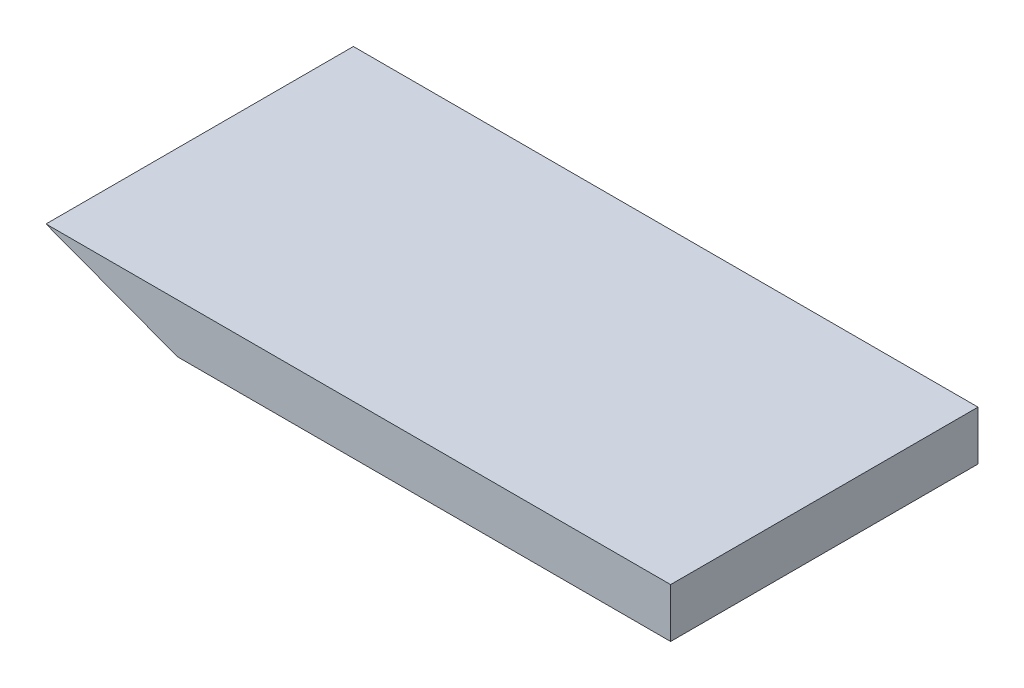
ISO-10303-21;
HEADER;
FILE_DESCRIPTION(('STEP AP214'),'2;1');
FILE_NAME('part.step','',(''),(''),'','','');
FILE_SCHEMA(('AUTOMOTIVE_DESIGN { 1 0 10303 214 1 1 1 1 }'));
ENDSEC;
DATA;
#1=APPLICATION_CONTEXT('core data for automotive mechanical design processes');
#2=APPLICATION_PROTOCOL_DEFINITION('international standard','automotive_design',2000,#1);
#3=PRODUCT_CONTEXT('',#1,'mechanical');
#4=PRODUCT('Part','Part','',(#3));
#5=PRODUCT_RELATED_PRODUCT_CATEGORY('part','',(#4));
#6=PRODUCT_DEFINITION_FORMATION('','',#4);
#7=PRODUCT_DEFINITION_CONTEXT('part definition',#1,'design');
#8=PRODUCT_DEFINITION('design','',#6,#7);
#9=PRODUCT_DEFINITION_SHAPE('','',#8);
#10=(LENGTH_UNIT() NAMED_UNIT(*) SI_UNIT(.MILLI.,.METRE.));
#11=(NAMED_UNIT(*) PLANE_ANGLE_UNIT() SI_UNIT($,.RADIAN.));
#12=(NAMED_UNIT(*) SI_UNIT($,.STERADIAN.) SOLID_ANGLE_UNIT());
#13=UNCERTAINTY_MEASURE_WITH_UNIT(LENGTH_MEASURE(1.E-05),#10,'distance_accuracy_value','');
#14=(GEOMETRIC_REPRESENTATION_CONTEXT(3) GLOBAL_UNCERTAINTY_ASSIGNED_CONTEXT((#13)) GLOBAL_UNIT_ASSIGNED_CONTEXT((#10,
#11,#12)) REPRESENTATION_CONTEXT('',''));
#15=CARTESIAN_POINT('',(0.,0.,0.));
#16=DIRECTION('',(0.,0.,1.));
#17=DIRECTION('',(1.,0.,0.));
#18=AXIS2_PLACEMENT_3D('',#15,#16,#17);
#19=CARTESIAN_POINT('',(19.,3.,-9.35));
#20=DIRECTION('',(-1.,0.,0.));
#21=DIRECTION('',(0.,0.,1.));
#22=AXIS2_PLACEMENT_3D('',#19,#20,#21);
#23=PLANE('',#22);
#24=DIRECTION('',(0.,0.,-1.));
#25=VECTOR('',#24,1.);
#26=CARTESIAN_POINT('',(19.,0.,-9.35));
#27=LINE('',#26,#25);
#28=CARTESIAN_POINT('',(19.,0.,9.35));
#29=VERTEX_POINT('',#28);
#30=CARTESIAN_POINT('',(19.,0.,-9.35));
#31=VERTEX_POINT('',#30);
#32=EDGE_CURVE('E97',#29,#31,#27,.T.);
#33=ORIENTED_EDGE('',*,*,#32,.T.);
#34=DIRECTION('',(0.,-1.,0.));
#35=VECTOR('',#34,1.);
#36=CARTESIAN_POINT('',(19.,3.,-9.35));
#37=LINE('',#36,#35);
#38=CARTESIAN_POINT('',(19.,3.,-9.35));
#39=VERTEX_POINT('',#38);
#40=EDGE_CURVE('E11',#39,#31,#37,.T.);
#41=ORIENTED_EDGE('',*,*,#40,.F.);
#42=DIRECTION('',(0.,0.,-1.));
#43=VECTOR('',#42,1.);
#44=CARTESIAN_POINT('',(19.,3.,-9.35));
#45=LINE('',#44,#43);
#46=CARTESIAN_POINT('',(19.,3.,9.35));
#47=VERTEX_POINT('',#46);
#48=EDGE_CURVE('E92',#47,#39,#45,.T.);
#49=ORIENTED_EDGE('',*,*,#48,.F.);
#50=DIRECTION('',(0.,-1.,0.));
#51=VECTOR('',#50,1.);
#52=CARTESIAN_POINT('',(19.,3.,9.35));
#53=LINE('',#52,#51);
#54=EDGE_CURVE('E53',#47,#29,#53,.T.);
#55=ORIENTED_EDGE('',*,*,#54,.T.);
#56=EDGE_LOOP('',(#33,#41,#49,#55));
#57=FACE_BOUND('',#56,.T.);
#58=ADVANCED_FACE('F43',(#57),#23,.F.);
#59=CARTESIAN_POINT('',(-19.,3.,-9.35));
#60=DIRECTION('',(0.,0.,1.));
#61=DIRECTION('',(1.,0.,0.));
#62=AXIS2_PLACEMENT_3D('',#59,#60,#61);
#63=PLANE('',#62);
#64=DIRECTION('',(-1.,0.,0.));
#65=VECTOR('',#64,1.);
#66=CARTESIAN_POINT('',(-19.,0.,-9.35));
#67=LINE('',#66,#65);
#68=CARTESIAN_POINT('',(-11.,0.,-9.35));
#69=VERTEX_POINT('',#68);
#70=EDGE_CURVE('E93',#31,#69,#67,.T.);
#71=ORIENTED_EDGE('',*,*,#70,.T.);
#72=DIRECTION('',(-0.936329177569045,0.351123441588392,0.));
#73=VECTOR('',#72,1.);
#74=CARTESIAN_POINT('',(-11.,0.,-9.35));
#75=LINE('',#74,#73);
#76=CARTESIAN_POINT('',(-19.,3.,-9.35));
#77=VERTEX_POINT('',#76);
#78=EDGE_CURVE('E60',#69,#77,#75,.T.);
#79=ORIENTED_EDGE('',*,*,#78,.T.);
#80=DIRECTION('',(-1.,0.,0.));
#81=VECTOR('',#80,1.);
#82=CARTESIAN_POINT('',(-19.,3.,-9.35));
#83=LINE('',#82,#81);
#84=EDGE_CURVE('E117',#39,#77,#83,.T.);
#85=ORIENTED_EDGE('',*,*,#84,.F.);
#86=ORIENTED_EDGE('',*,*,#40,.T.);
#87=EDGE_LOOP('',(#71,#79,#85,#86));
#88=FACE_BOUND('',#87,.T.);
#89=ADVANCED_FACE('F133',(#88),#63,.F.);
#90=CARTESIAN_POINT('',(-19.,3.,9.35));
#91=DIRECTION('',(0.,0.,-1.));
#92=DIRECTION('',(-1.,0.,0.));
#93=AXIS2_PLACEMENT_3D('',#90,#91,#92);
#94=PLANE('',#93);
#95=DIRECTION('',(1.,0.,0.));
#96=VECTOR('',#95,1.);
#97=CARTESIAN_POINT('',(-19.,3.,9.35));
#98=LINE('',#97,#96);
#99=CARTESIAN_POINT('',(-19.,3.,9.35));
#100=VERTEX_POINT('',#99);
#101=EDGE_CURVE('E69',#100,#47,#98,.T.);
#102=ORIENTED_EDGE('',*,*,#101,.F.);
#103=DIRECTION('',(0.936329177569045,-0.351123441588392,0.));
#104=VECTOR('',#103,1.);
#105=CARTESIAN_POINT('',(-19.,3.,9.35));
#106=LINE('',#105,#104);
#107=CARTESIAN_POINT('',(-11.,0.,9.350006));
#108=VERTEX_POINT('',#107);
#109=EDGE_CURVE('E88',#100,#108,#106,.T.);
#110=ORIENTED_EDGE('',*,*,#109,.T.);
#111=DIRECTION('',(1.,0.,0.));
#112=VECTOR('',#111,1.);
#113=CARTESIAN_POINT('',(-19.,0.,9.35));
#114=LINE('',#113,#112);
#115=EDGE_CURVE('E46',#108,#29,#114,.T.);
#116=ORIENTED_EDGE('',*,*,#115,.T.);
#117=ORIENTED_EDGE('',*,*,#54,.F.);
#118=EDGE_LOOP('',(#102,#110,#116,#117));
#119=FACE_BOUND('',#118,.T.);
#120=ADVANCED_FACE('F84',(#119),#94,.F.);
#121=CARTESIAN_POINT('',(0.,3.,0.));
#122=DIRECTION('',(0.,1.,0.));
#123=DIRECTION('',(0.,0.,1.));
#124=AXIS2_PLACEMENT_3D('',#121,#122,#123);
#125=PLANE('',#124);
#126=ORIENTED_EDGE('',*,*,#48,.T.);
#127=ORIENTED_EDGE('',*,*,#84,.T.);
#128=DIRECTION('',(0.,0.,1.));
#129=VECTOR('',#128,1.);
#130=CARTESIAN_POINT('',(-19.,3.,-9.35));
#131=LINE('',#130,#129);
#132=EDGE_CURVE('E114',#77,#100,#131,.T.);
#133=ORIENTED_EDGE('',*,*,#132,.T.);
#134=ORIENTED_EDGE('',*,*,#101,.T.);
#135=EDGE_LOOP('',(#126,#127,#133,#134));
#136=FACE_BOUND('',#135,.T.);
#137=ADVANCED_FACE('F135',(#136),#125,.T.);
#138=CARTESIAN_POINT('',(0.,0.,0.));
#139=DIRECTION('',(0.,1.,0.));
#140=DIRECTION('',(0.,0.,1.));
#141=AXIS2_PLACEMENT_3D('',#138,#139,#140);
#142=PLANE('',#141);
#143=ORIENTED_EDGE('',*,*,#115,.F.);
#144=DIRECTION('',(0.,0.,1.));
#145=VECTOR('',#144,1.);
#146=CARTESIAN_POINT('',(-11.,0.,-9.35));
#147=LINE('',#146,#145);
#148=EDGE_CURVE('E108',#69,#108,#147,.T.);
#149=ORIENTED_EDGE('',*,*,#148,.F.);
#150=ORIENTED_EDGE('',*,*,#70,.F.);
#151=ORIENTED_EDGE('',*,*,#32,.F.);
#152=EDGE_LOOP('',(#143,#149,#150,#151));
#153=FACE_BOUND('',#152,.T.);
#154=ADVANCED_FACE('F100',(#153),#142,.F.);
#155=CARTESIAN_POINT('',(-11.,0.,-9.35));
#156=DIRECTION('',(0.351123441588392,0.936329177569045,0.));
#157=DIRECTION('',(-0.936329177569045,0.351123441588392,0.));
#158=AXIS2_PLACEMENT_3D('',#155,#156,#157);
#159=PLANE('',#158);
#160=ORIENTED_EDGE('',*,*,#132,.F.);
#161=ORIENTED_EDGE('',*,*,#78,.F.);
#162=ORIENTED_EDGE('',*,*,#148,.T.);
#163=ORIENTED_EDGE('',*,*,#109,.F.);
#164=EDGE_LOOP('',(#160,#161,#162,#163));
#165=FACE_BOUND('',#164,.T.);
#166=ADVANCED_FACE('F136',(#165),#159,.F.);
#167=CLOSED_SHELL('',(#58,#89,#120,#137,#154,#166));
#168=MANIFOLD_SOLID_BREP('B2',#167);
#169=ADVANCED_BREP_SHAPE_REPRESENTATION('',(#18,#168),#14);
#170=SHAPE_DEFINITION_REPRESENTATION(#9,#169);
ENDSEC;
END-ISO-10303-21;
